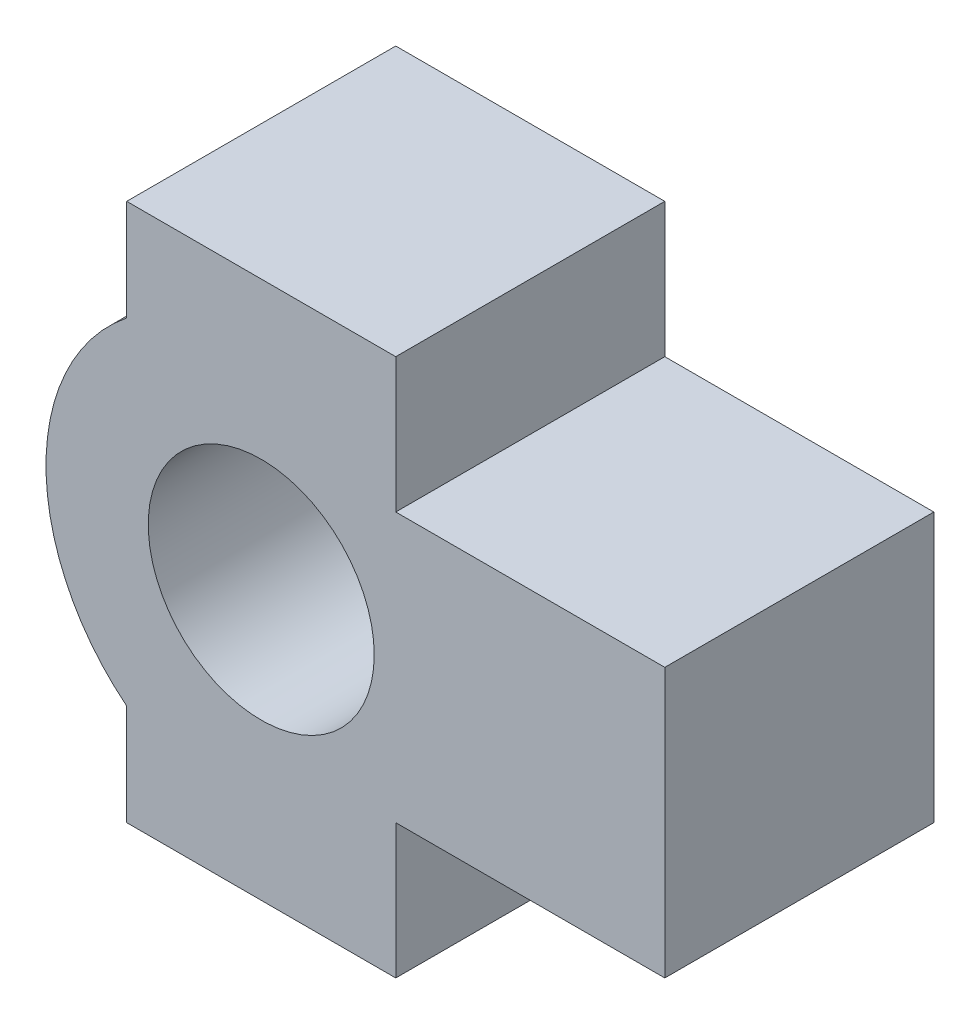
ISO-10303-21;
HEADER;
FILE_DESCRIPTION(('STEP AP214'),'2;1');
FILE_NAME('part.step','',(''),(''),'','','');
FILE_SCHEMA(('AUTOMOTIVE_DESIGN { 1 0 10303 214 1 1 1 1 }'));
ENDSEC;
DATA;
#1=APPLICATION_CONTEXT('core data for automotive mechanical design processes');
#2=APPLICATION_PROTOCOL_DEFINITION('international standard','automotive_design',2000,#1);
#3=PRODUCT_CONTEXT('',#1,'mechanical');
#4=PRODUCT('Part','Part','',(#3));
#5=PRODUCT_RELATED_PRODUCT_CATEGORY('part','',(#4));
#6=PRODUCT_DEFINITION_FORMATION('','',#4);
#7=PRODUCT_DEFINITION_CONTEXT('part definition',#1,'design');
#8=PRODUCT_DEFINITION('design','',#6,#7);
#9=PRODUCT_DEFINITION_SHAPE('','',#8);
#10=(LENGTH_UNIT() NAMED_UNIT(*) SI_UNIT(.MILLI.,.METRE.));
#11=(NAMED_UNIT(*) PLANE_ANGLE_UNIT() SI_UNIT($,.RADIAN.));
#12=(NAMED_UNIT(*) SI_UNIT($,.STERADIAN.) SOLID_ANGLE_UNIT());
#13=UNCERTAINTY_MEASURE_WITH_UNIT(LENGTH_MEASURE(1.E-05),#10,'distance_accuracy_value','');
#14=(GEOMETRIC_REPRESENTATION_CONTEXT(3) GLOBAL_UNCERTAINTY_ASSIGNED_CONTEXT((#13)) GLOBAL_UNIT_ASSIGNED_CONTEXT((#10,
#11,#12)) REPRESENTATION_CONTEXT('',''));
#15=CARTESIAN_POINT('',(0.,0.,0.));
#16=DIRECTION('',(0.,0.,1.));
#17=DIRECTION('',(1.,0.,0.));
#18=AXIS2_PLACEMENT_3D('',#15,#16,#17);
#19=CARTESIAN_POINT('',(-21.554054054054,7.0945945945946,5.));
#20=DIRECTION('',(1.,0.,0.));
#21=DIRECTION('',(0.,0.,-1.));
#22=AXIS2_PLACEMENT_3D('',#19,#20,#21);
#23=PLANE('',#22);
#24=DIRECTION('',(0.,-1.,0.));
#25=VECTOR('',#24,1.);
#26=CARTESIAN_POINT('',(-21.554054054054,7.0945945945946,0.));
#27=LINE('',#26,#25);
#28=CARTESIAN_POINT('',(-21.554054054054,7.0945945945946,0.));
#29=VERTEX_POINT('',#28);
#30=CARTESIAN_POINT('',(-21.554054054054,5.2170935937938,0.));
#31=VERTEX_POINT('',#30);
#32=EDGE_CURVE('E124',#29,#31,#27,.T.);
#33=ORIENTED_EDGE('',*,*,#32,.T.);
#34=DIRECTION('',(0.,0.,1.));
#35=VECTOR('',#34,1.);
#36=CARTESIAN_POINT('',(-21.554054054054,5.2170935937938,0.));
#37=LINE('',#36,#35);
#38=CARTESIAN_POINT('',(-21.554054054054,5.2170935937938,5.));
#39=VERTEX_POINT('',#38);
#40=EDGE_CURVE('E59',#31,#39,#37,.T.);
#41=ORIENTED_EDGE('',*,*,#40,.T.);
#42=DIRECTION('',(0.,-1.,0.));
#43=VECTOR('',#42,1.);
#44=CARTESIAN_POINT('',(-21.554054054054,7.0945945945946,5.));
#45=LINE('',#44,#43);
#46=CARTESIAN_POINT('',(-21.554054054054,7.0945945945946,5.));
#47=VERTEX_POINT('',#46);
#48=EDGE_CURVE('E148',#47,#39,#45,.T.);
#49=ORIENTED_EDGE('',*,*,#48,.F.);
#50=DIRECTION('',(0.,0.,-1.));
#51=VECTOR('',#50,1.);
#52=CARTESIAN_POINT('',(-21.554054054054,7.0945945945946,5.));
#53=LINE('',#52,#51);
#54=EDGE_CURVE('E44',#47,#29,#53,.T.);
#55=ORIENTED_EDGE('',*,*,#54,.T.);
#56=EDGE_LOOP('',(#33,#41,#49,#55));
#57=FACE_BOUND('',#56,.T.);
#58=ADVANCED_FACE('F35',(#57),#23,.F.);
#59=CARTESIAN_POINT('',(-16.554054054054,4.5945945945946,5.));
#60=DIRECTION('',(-1.,0.,0.));
#61=DIRECTION('',(0.,0.,1.));
#62=AXIS2_PLACEMENT_3D('',#59,#60,#61);
#63=PLANE('',#62);
#64=DIRECTION('',(0.,1.,0.));
#65=VECTOR('',#64,1.);
#66=CARTESIAN_POINT('',(-16.554054054054,4.5945945945946,0.));
#67=LINE('',#66,#65);
#68=CARTESIAN_POINT('',(-16.554054054054,4.5945945945946,0.));
#69=VERTEX_POINT('',#68);
#70=CARTESIAN_POINT('',(-16.554054054054,7.0945945945946,0.));
#71=VERTEX_POINT('',#70);
#72=EDGE_CURVE('E161',#69,#71,#67,.T.);
#73=ORIENTED_EDGE('',*,*,#72,.T.);
#74=DIRECTION('',(0.,0.,-1.));
#75=VECTOR('',#74,1.);
#76=CARTESIAN_POINT('',(-16.554054054054,7.0945945945946,5.));
#77=LINE('',#76,#75);
#78=CARTESIAN_POINT('',(-16.554054054054,7.0945945945946,5.));
#79=VERTEX_POINT('',#78);
#80=EDGE_CURVE('E11',#79,#71,#77,.T.);
#81=ORIENTED_EDGE('',*,*,#80,.F.);
#82=DIRECTION('',(0.,1.,0.));
#83=VECTOR('',#82,1.);
#84=CARTESIAN_POINT('',(-16.554054054054,4.5945945945946,5.));
#85=LINE('',#84,#83);
#86=CARTESIAN_POINT('',(-16.554054054054,4.5945945945946,5.));
#87=VERTEX_POINT('',#86);
#88=EDGE_CURVE('E142',#87,#79,#85,.T.);
#89=ORIENTED_EDGE('',*,*,#88,.F.);
#90=DIRECTION('',(0.,0.,-1.));
#91=VECTOR('',#90,1.);
#92=CARTESIAN_POINT('',(-16.554054054054,4.5945945945946,5.));
#93=LINE('',#92,#91);
#94=EDGE_CURVE('E160',#87,#69,#93,.T.);
#95=ORIENTED_EDGE('',*,*,#94,.T.);
#96=EDGE_LOOP('',(#73,#81,#89,#95));
#97=FACE_BOUND('',#96,.T.);
#98=ADVANCED_FACE('F37',(#97),#63,.F.);
#99=CARTESIAN_POINT('',(-16.554054054054,7.0945945945946,5.));
#100=DIRECTION('',(0.,-1.,0.));
#101=DIRECTION('',(1.,0.,0.));
#102=AXIS2_PLACEMENT_3D('',#99,#100,#101);
#103=PLANE('',#102);
#104=DIRECTION('',(-1.,0.,0.));
#105=VECTOR('',#104,1.);
#106=CARTESIAN_POINT('',(-16.554054054054,7.0945945945946,0.));
#107=LINE('',#106,#105);
#108=EDGE_CURVE('E125',#71,#29,#107,.T.);
#109=ORIENTED_EDGE('',*,*,#108,.T.);
#110=ORIENTED_EDGE('',*,*,#54,.F.);
#111=DIRECTION('',(-1.,0.,0.));
#112=VECTOR('',#111,1.);
#113=CARTESIAN_POINT('',(-16.554054054054,7.0945945945946,5.));
#114=LINE('',#113,#112);
#115=EDGE_CURVE('E145',#79,#47,#114,.T.);
#116=ORIENTED_EDGE('',*,*,#115,.F.);
#117=ORIENTED_EDGE('',*,*,#80,.T.);
#118=EDGE_LOOP('',(#109,#110,#116,#117));
#119=FACE_BOUND('',#118,.T.);
#120=ADVANCED_FACE('F194',(#119),#103,.F.);
#121=CARTESIAN_POINT('',(-21.554054054054,-1.0279044046046,5.));
#122=VERTEX_POINT('',#121);
#123=CARTESIAN_POINT('',(-21.554054054054,-2.9054054054054,5.));
#124=VERTEX_POINT('',#123);
#125=EDGE_CURVE('E51',#122,#124,#45,.T.);
#126=ORIENTED_EDGE('',*,*,#125,.F.);
#127=DIRECTION('',(0.,0.,1.));
#128=VECTOR('',#127,1.);
#129=CARTESIAN_POINT('',(-21.554054054054,-1.0279044046046,0.));
#130=LINE('',#129,#128);
#131=CARTESIAN_POINT('',(-21.554054054054,-1.0279044046046,0.));
#132=VERTEX_POINT('',#131);
#133=EDGE_CURVE('E127',#132,#122,#130,.T.);
#134=ORIENTED_EDGE('',*,*,#133,.F.);
#135=CARTESIAN_POINT('',(-21.554054054054,-2.9054054054054,0.));
#136=VERTEX_POINT('',#135);
#137=EDGE_CURVE('E115',#132,#136,#27,.T.);
#138=ORIENTED_EDGE('',*,*,#137,.T.);
#139=DIRECTION('',(0.,0.,-1.));
#140=VECTOR('',#139,1.);
#141=CARTESIAN_POINT('',(-21.554054054054,-2.9054054054054,5.));
#142=LINE('',#141,#140);
#143=EDGE_CURVE('E187',#124,#136,#142,.T.);
#144=ORIENTED_EDGE('',*,*,#143,.F.);
#145=EDGE_LOOP('',(#126,#134,#138,#144));
#146=FACE_BOUND('',#145,.T.);
#147=ADVANCED_FACE('F128',(#146),#23,.F.);
#148=CARTESIAN_POINT('',(-21.554054054054,-2.9054054054054,5.));
#149=DIRECTION('',(0.,1.,0.));
#150=DIRECTION('',(0.,0.,1.));
#151=AXIS2_PLACEMENT_3D('',#148,#149,#150);
#152=PLANE('',#151);
#153=DIRECTION('',(1.,0.,0.));
#154=VECTOR('',#153,1.);
#155=CARTESIAN_POINT('',(-21.554054054054,-2.9054054054054,0.));
#156=LINE('',#155,#154);
#157=CARTESIAN_POINT('',(-16.554054054054,-2.9054054054054,0.));
#158=VERTEX_POINT('',#157);
#159=EDGE_CURVE('E122',#136,#158,#156,.T.);
#160=ORIENTED_EDGE('',*,*,#159,.T.);
#161=DIRECTION('',(0.,0.,-1.));
#162=VECTOR('',#161,1.);
#163=CARTESIAN_POINT('',(-16.554054054054,-2.9054054054054,5.));
#164=LINE('',#163,#162);
#165=CARTESIAN_POINT('',(-16.554054054054,-2.9054054054054,5.));
#166=VERTEX_POINT('',#165);
#167=EDGE_CURVE('E184',#166,#158,#164,.T.);
#168=ORIENTED_EDGE('',*,*,#167,.F.);
#169=DIRECTION('',(1.,0.,0.));
#170=VECTOR('',#169,1.);
#171=CARTESIAN_POINT('',(-21.554054054054,-2.9054054054054,5.));
#172=LINE('',#171,#170);
#173=EDGE_CURVE('E150',#124,#166,#172,.T.);
#174=ORIENTED_EDGE('',*,*,#173,.F.);
#175=ORIENTED_EDGE('',*,*,#143,.T.);
#176=EDGE_LOOP('',(#160,#168,#174,#175));
#177=FACE_BOUND('',#176,.T.);
#178=ADVANCED_FACE('F218',(#177),#152,.F.);
#179=CARTESIAN_POINT('',(-16.554054054054,-2.9054054054054,5.));
#180=DIRECTION('',(-1.,0.,0.));
#181=DIRECTION('',(0.,0.,1.));
#182=AXIS2_PLACEMENT_3D('',#179,#180,#181);
#183=PLANE('',#182);
#184=DIRECTION('',(0.,1.,0.));
#185=VECTOR('',#184,1.);
#186=CARTESIAN_POINT('',(-16.554054054054,-2.9054054054054,0.));
#187=LINE('',#186,#185);
#188=CARTESIAN_POINT('',(-16.554054054054,-0.405405405405399,0.));
#189=VERTEX_POINT('',#188);
#190=EDGE_CURVE('E166',#158,#189,#187,.T.);
#191=ORIENTED_EDGE('',*,*,#190,.T.);
#192=DIRECTION('',(0.,0.,-1.));
#193=VECTOR('',#192,1.);
#194=CARTESIAN_POINT('',(-16.554054054054,-0.405405405405399,5.));
#195=LINE('',#194,#193);
#196=CARTESIAN_POINT('',(-16.554054054054,-0.405405405405399,5.));
#197=VERTEX_POINT('',#196);
#198=EDGE_CURVE('E181',#197,#189,#195,.T.);
#199=ORIENTED_EDGE('',*,*,#198,.F.);
#200=DIRECTION('',(0.,1.,0.));
#201=VECTOR('',#200,1.);
#202=CARTESIAN_POINT('',(-16.554054054054,-2.9054054054054,5.));
#203=LINE('',#202,#201);
#204=EDGE_CURVE('E152',#166,#197,#203,.T.);
#205=ORIENTED_EDGE('',*,*,#204,.F.);
#206=ORIENTED_EDGE('',*,*,#167,.T.);
#207=EDGE_LOOP('',(#191,#199,#205,#206));
#208=FACE_BOUND('',#207,.T.);
#209=ADVANCED_FACE('F214',(#208),#183,.F.);
#210=CARTESIAN_POINT('',(-16.554054054054,-0.405405405405399,5.));
#211=DIRECTION('',(0.,1.,0.));
#212=DIRECTION('',(0.,0.,1.));
#213=AXIS2_PLACEMENT_3D('',#210,#211,#212);
#214=PLANE('',#213);
#215=DIRECTION('',(1.,0.,0.));
#216=VECTOR('',#215,1.);
#217=CARTESIAN_POINT('',(-16.554054054054,-0.405405405405399,0.));
#218=LINE('',#217,#216);
#219=CARTESIAN_POINT('',(-11.554054054054,-0.405405405405399,0.));
#220=VERTEX_POINT('',#219);
#221=EDGE_CURVE('E168',#189,#220,#218,.T.);
#222=ORIENTED_EDGE('',*,*,#221,.T.);
#223=DIRECTION('',(0.,0.,-1.));
#224=VECTOR('',#223,1.);
#225=CARTESIAN_POINT('',(-11.554054054054,-0.405405405405399,5.));
#226=LINE('',#225,#224);
#227=CARTESIAN_POINT('',(-11.554054054054,-0.405405405405399,5.));
#228=VERTEX_POINT('',#227);
#229=EDGE_CURVE('E178',#228,#220,#226,.T.);
#230=ORIENTED_EDGE('',*,*,#229,.F.);
#231=DIRECTION('',(1.,0.,0.));
#232=VECTOR('',#231,1.);
#233=CARTESIAN_POINT('',(-16.554054054054,-0.405405405405399,5.));
#234=LINE('',#233,#232);
#235=EDGE_CURVE('E154',#197,#228,#234,.T.);
#236=ORIENTED_EDGE('',*,*,#235,.F.);
#237=ORIENTED_EDGE('',*,*,#198,.T.);
#238=EDGE_LOOP('',(#222,#230,#236,#237));
#239=FACE_BOUND('',#238,.T.);
#240=ADVANCED_FACE('F210',(#239),#214,.F.);
#241=CARTESIAN_POINT('',(-11.554054054054,-0.405405405405399,5.));
#242=DIRECTION('',(-1.,0.,0.));
#243=DIRECTION('',(0.,0.,1.));
#244=AXIS2_PLACEMENT_3D('',#241,#242,#243);
#245=PLANE('',#244);
#246=DIRECTION('',(0.,1.,0.));
#247=VECTOR('',#246,1.);
#248=CARTESIAN_POINT('',(-11.554054054054,-0.405405405405399,0.));
#249=LINE('',#248,#247);
#250=CARTESIAN_POINT('',(-11.554054054054,4.5945945945946,0.));
#251=VERTEX_POINT('',#250);
#252=EDGE_CURVE('E170',#220,#251,#249,.T.);
#253=ORIENTED_EDGE('',*,*,#252,.T.);
#254=DIRECTION('',(0.,0.,-1.));
#255=VECTOR('',#254,1.);
#256=CARTESIAN_POINT('',(-11.554054054054,4.5945945945946,5.));
#257=LINE('',#256,#255);
#258=CARTESIAN_POINT('',(-11.554054054054,4.5945945945946,5.));
#259=VERTEX_POINT('',#258);
#260=EDGE_CURVE('E175',#259,#251,#257,.T.);
#261=ORIENTED_EDGE('',*,*,#260,.F.);
#262=DIRECTION('',(0.,1.,0.));
#263=VECTOR('',#262,1.);
#264=CARTESIAN_POINT('',(-11.554054054054,-0.405405405405399,5.));
#265=LINE('',#264,#263);
#266=EDGE_CURVE('E156',#228,#259,#265,.T.);
#267=ORIENTED_EDGE('',*,*,#266,.F.);
#268=ORIENTED_EDGE('',*,*,#229,.T.);
#269=EDGE_LOOP('',(#253,#261,#267,#268));
#270=FACE_BOUND('',#269,.T.);
#271=ADVANCED_FACE('F205',(#270),#245,.F.);
#272=CARTESIAN_POINT('',(-11.554054054054,4.5945945945946,5.));
#273=DIRECTION('',(0.,-1.,0.));
#274=DIRECTION('',(1.,0.,0.));
#275=AXIS2_PLACEMENT_3D('',#272,#273,#274);
#276=PLANE('',#275);
#277=DIRECTION('',(-1.,0.,0.));
#278=VECTOR('',#277,1.);
#279=CARTESIAN_POINT('',(-11.554054054054,4.5945945945946,0.));
#280=LINE('',#279,#278);
#281=EDGE_CURVE('E146',#251,#69,#280,.T.);
#282=ORIENTED_EDGE('',*,*,#281,.T.);
#283=ORIENTED_EDGE('',*,*,#94,.F.);
#284=DIRECTION('',(-1.,0.,0.));
#285=VECTOR('',#284,1.);
#286=CARTESIAN_POINT('',(-11.554054054054,4.5945945945946,5.));
#287=LINE('',#286,#285);
#288=EDGE_CURVE('E158',#259,#87,#287,.T.);
#289=ORIENTED_EDGE('',*,*,#288,.F.);
#290=ORIENTED_EDGE('',*,*,#260,.T.);
#291=EDGE_LOOP('',(#282,#283,#289,#290));
#292=FACE_BOUND('',#291,.T.);
#293=ADVANCED_FACE('F200',(#292),#276,.F.);
#294=CARTESIAN_POINT('',(0.,0.,5.));
#295=DIRECTION('',(0.,0.,1.));
#296=DIRECTION('',(1.,0.,0.));
#297=AXIS2_PLACEMENT_3D('',#294,#295,#296);
#298=PLANE('',#297);
#299=CARTESIAN_POINT('',(-19.054054054054,2.0945945945946,5.));
#300=DIRECTION('',(0.,0.,1.));
#301=DIRECTION('',(1.,0.,0.));
#302=AXIS2_PLACEMENT_3D('',#299,#300,#301);
#303=CIRCLE('',#302,2.1);
#304=CARTESIAN_POINT('',(-16.954054054054,2.0945945945946,5.));
#305=VERTEX_POINT('',#304);
#306=EDGE_CURVE('E138',#305,#305,#303,.T.);
#307=ORIENTED_EDGE('',*,*,#306,.F.);
#308=EDGE_LOOP('',(#307));
#309=FACE_BOUND('',#308,.T.);
#310=ORIENTED_EDGE('',*,*,#88,.T.);
#311=ORIENTED_EDGE('',*,*,#115,.T.);
#312=ORIENTED_EDGE('',*,*,#48,.T.);
#313=CARTESIAN_POINT('',(-19.054054054054,2.0945945945946,5.));
#314=DIRECTION('',(0.,0.,1.));
#315=DIRECTION('',(1.,0.,0.));
#316=AXIS2_PLACEMENT_3D('',#313,#314,#315);
#317=CIRCLE('',#316,4.);
#318=EDGE_CURVE('E134',#39,#122,#317,.T.);
#319=ORIENTED_EDGE('',*,*,#318,.T.);
#320=ORIENTED_EDGE('',*,*,#125,.T.);
#321=ORIENTED_EDGE('',*,*,#173,.T.);
#322=ORIENTED_EDGE('',*,*,#204,.T.);
#323=ORIENTED_EDGE('',*,*,#235,.T.);
#324=ORIENTED_EDGE('',*,*,#266,.T.);
#325=ORIENTED_EDGE('',*,*,#288,.T.);
#326=EDGE_LOOP('',(#310,#311,#312,#319,#320,#321,#322,#323,#324,#325));
#327=FACE_BOUND('',#326,.T.);
#328=ADVANCED_FACE('F220',(#309,#327),#298,.T.);
#329=CARTESIAN_POINT('',(0.,0.,0.));
#330=DIRECTION('',(0.,0.,1.));
#331=DIRECTION('',(1.,0.,0.));
#332=AXIS2_PLACEMENT_3D('',#329,#330,#331);
#333=PLANE('',#332);
#334=CARTESIAN_POINT('',(-19.054054054054,2.0945945945946,0.));
#335=DIRECTION('',(0.,0.,1.));
#336=DIRECTION('',(1.,0.,0.));
#337=AXIS2_PLACEMENT_3D('',#334,#335,#336);
#338=CIRCLE('',#337,2.1);
#339=CARTESIAN_POINT('',(-16.954054054054,2.0945945945946,0.));
#340=VERTEX_POINT('',#339);
#341=EDGE_CURVE('E39',#340,#340,#338,.T.);
#342=ORIENTED_EDGE('',*,*,#341,.T.);
#343=EDGE_LOOP('',(#342));
#344=FACE_BOUND('',#343,.T.);
#345=ORIENTED_EDGE('',*,*,#72,.F.);
#346=ORIENTED_EDGE('',*,*,#281,.F.);
#347=ORIENTED_EDGE('',*,*,#252,.F.);
#348=ORIENTED_EDGE('',*,*,#221,.F.);
#349=ORIENTED_EDGE('',*,*,#190,.F.);
#350=ORIENTED_EDGE('',*,*,#159,.F.);
#351=ORIENTED_EDGE('',*,*,#137,.F.);
#352=CARTESIAN_POINT('',(-19.054054054054,2.0945945945946,0.));
#353=DIRECTION('',(0.,0.,1.));
#354=DIRECTION('',(1.,0.,0.));
#355=AXIS2_PLACEMENT_3D('',#352,#353,#354);
#356=CIRCLE('',#355,4.);
#357=EDGE_CURVE('E120',#31,#132,#356,.T.);
#358=ORIENTED_EDGE('',*,*,#357,.F.);
#359=ORIENTED_EDGE('',*,*,#32,.F.);
#360=ORIENTED_EDGE('',*,*,#108,.F.);
#361=EDGE_LOOP('',(#345,#346,#347,#348,#349,#350,#351,#358,#359,#360));
#362=FACE_BOUND('',#361,.T.);
#363=ADVANCED_FACE('F117',(#344,#362),#333,.F.);
#364=CARTESIAN_POINT('',(-19.054054054054,2.0945945945946,-5.));
#365=DIRECTION('',(0.,0.,1.));
#366=DIRECTION('',(1.,0.,0.));
#367=AXIS2_PLACEMENT_3D('',#364,#365,#366);
#368=CYLINDRICAL_SURFACE('',#367,2.1);
#369=ORIENTED_EDGE('',*,*,#306,.T.);
#370=EDGE_LOOP('',(#369));
#371=FACE_BOUND('',#370,.T.);
#372=ORIENTED_EDGE('',*,*,#341,.F.);
#373=EDGE_LOOP('',(#372));
#374=FACE_BOUND('',#373,.T.);
#375=ADVANCED_FACE('F228',(#371,#374),#368,.F.);
#376=CARTESIAN_POINT('',(-19.054054054054,2.0945945945946,0.));
#377=DIRECTION('',(0.,0.,1.));
#378=DIRECTION('',(1.,0.,0.));
#379=AXIS2_PLACEMENT_3D('',#376,#377,#378);
#380=CYLINDRICAL_SURFACE('',#379,4.);
#381=ORIENTED_EDGE('',*,*,#318,.F.);
#382=ORIENTED_EDGE('',*,*,#40,.F.);
#383=ORIENTED_EDGE('',*,*,#357,.T.);
#384=ORIENTED_EDGE('',*,*,#133,.T.);
#385=EDGE_LOOP('',(#381,#382,#383,#384));
#386=FACE_BOUND('',#385,.T.);
#387=ADVANCED_FACE('F133',(#386),#380,.T.);
#388=CLOSED_SHELL('',(#58,#98,#120,#147,#178,#209,#240,#271,#293,#328,#363,#375,#387));
#389=MANIFOLD_SOLID_BREP('B2',#388);
#390=ADVANCED_BREP_SHAPE_REPRESENTATION('',(#18,#389),#14);
#391=SHAPE_DEFINITION_REPRESENTATION(#9,#390);
ENDSEC;
END-ISO-10303-21;
